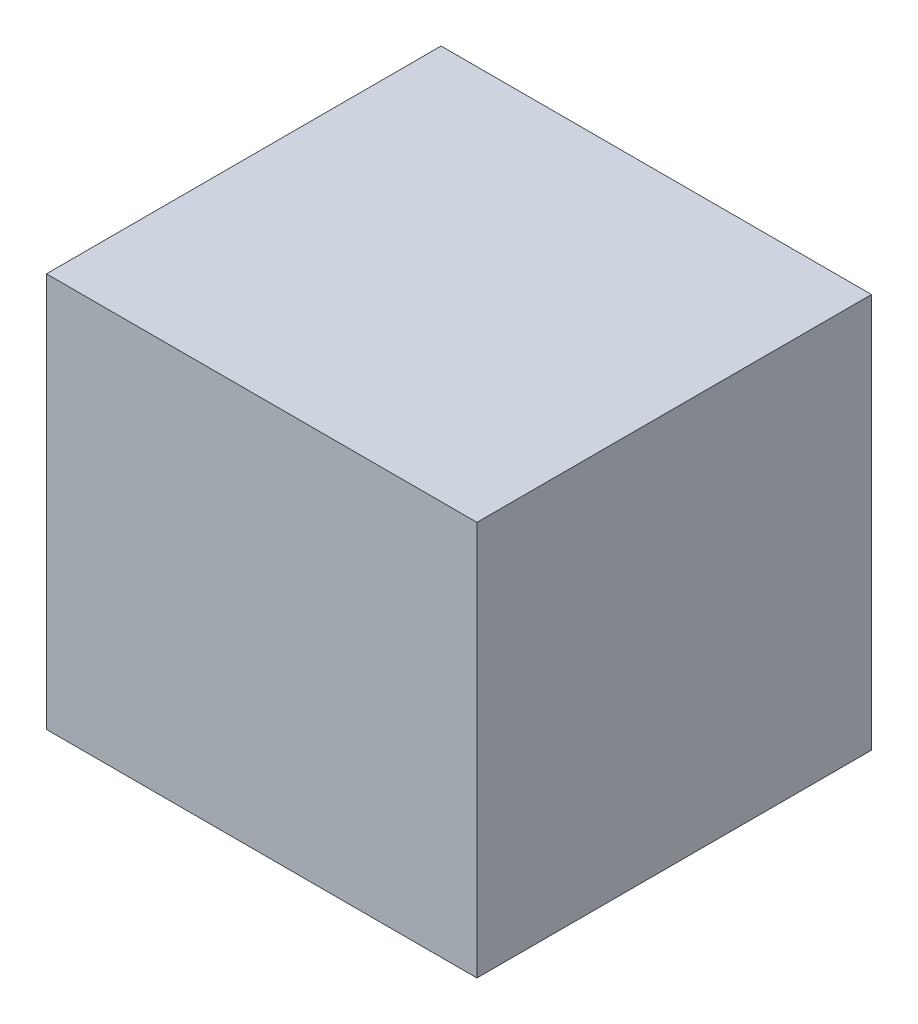
ISO-10303-21;
HEADER;
FILE_DESCRIPTION(('STEP AP214'),'2;1');
FILE_NAME('part.step','',(''),(''),'','','');
FILE_SCHEMA(('AUTOMOTIVE_DESIGN { 1 0 10303 214 1 1 1 1 }'));
ENDSEC;
DATA;
#1=APPLICATION_CONTEXT('core data for automotive mechanical design processes');
#2=APPLICATION_PROTOCOL_DEFINITION('international standard','automotive_design',2000,#1);
#3=PRODUCT_CONTEXT('',#1,'mechanical');
#4=PRODUCT('Part','Part','',(#3));
#5=PRODUCT_RELATED_PRODUCT_CATEGORY('part','',(#4));
#6=PRODUCT_DEFINITION_FORMATION('','',#4);
#7=PRODUCT_DEFINITION_CONTEXT('part definition',#1,'design');
#8=PRODUCT_DEFINITION('design','',#6,#7);
#9=PRODUCT_DEFINITION_SHAPE('','',#8);
#10=(LENGTH_UNIT() NAMED_UNIT(*) SI_UNIT(.MILLI.,.METRE.));
#11=(NAMED_UNIT(*) PLANE_ANGLE_UNIT() SI_UNIT($,.RADIAN.));
#12=(NAMED_UNIT(*) SI_UNIT($,.STERADIAN.) SOLID_ANGLE_UNIT());
#13=UNCERTAINTY_MEASURE_WITH_UNIT(LENGTH_MEASURE(1.E-05),#10,'distance_accuracy_value','');
#14=(GEOMETRIC_REPRESENTATION_CONTEXT(3) GLOBAL_UNCERTAINTY_ASSIGNED_CONTEXT((#13)) GLOBAL_UNIT_ASSIGNED_CONTEXT((#10,
#11,#12)) REPRESENTATION_CONTEXT('',''));
#15=CARTESIAN_POINT('',(0.,0.,0.));
#16=DIRECTION('',(0.,0.,1.));
#17=DIRECTION('',(1.,0.,0.));
#18=AXIS2_PLACEMENT_3D('',#15,#16,#17);
#19=CARTESIAN_POINT('',(-1200.,2200.,1100.));
#20=DIRECTION('',(1.,0.,0.));
#21=DIRECTION('',(0.,0.,-1.));
#22=AXIS2_PLACEMENT_3D('',#19,#20,#21);
#23=PLANE('',#22);
#24=DIRECTION('',(0.,0.,1.));
#25=VECTOR('',#24,1.);
#26=CARTESIAN_POINT('',(-1200.,0.,1100.));
#27=LINE('',#26,#25);
#28=CARTESIAN_POINT('',(-1200.,0.,-1100.));
#29=VERTEX_POINT('',#28);
#30=CARTESIAN_POINT('',(-1200.,0.,1100.));
#31=VERTEX_POINT('',#30);
#32=EDGE_CURVE('E116',#29,#31,#27,.T.);
#33=ORIENTED_EDGE('',*,*,#32,.T.);
#34=DIRECTION('',(0.,-1.,0.));
#35=VECTOR('',#34,1.);
#36=CARTESIAN_POINT('',(-1200.,2200.,1100.));
#37=LINE('',#36,#35);
#38=CARTESIAN_POINT('',(-1200.,2200.,1100.));
#39=VERTEX_POINT('',#38);
#40=EDGE_CURVE('E48',#39,#31,#37,.T.);
#41=ORIENTED_EDGE('',*,*,#40,.F.);
#42=DIRECTION('',(0.,0.,1.));
#43=VECTOR('',#42,1.);
#44=CARTESIAN_POINT('',(-1200.,2200.,1100.));
#45=LINE('',#44,#43);
#46=CARTESIAN_POINT('',(-1200.,2200.,-1100.));
#47=VERTEX_POINT('',#46);
#48=EDGE_CURVE('E99',#47,#39,#45,.T.);
#49=ORIENTED_EDGE('',*,*,#48,.F.);
#50=DIRECTION('',(0.,-1.,0.));
#51=VECTOR('',#50,1.);
#52=CARTESIAN_POINT('',(-1200.,2200.,-1100.));
#53=LINE('',#52,#51);
#54=EDGE_CURVE('E112',#47,#29,#53,.T.);
#55=ORIENTED_EDGE('',*,*,#54,.T.);
#56=EDGE_LOOP('',(#33,#41,#49,#55));
#57=FACE_BOUND('',#56,.T.);
#58=ADVANCED_FACE('F45',(#57),#23,.F.);
#59=CARTESIAN_POINT('',(1200.,2200.,1100.));
#60=DIRECTION('',(0.,0.,-1.));
#61=DIRECTION('',(-1.,0.,0.));
#62=AXIS2_PLACEMENT_3D('',#59,#60,#61);
#63=PLANE('',#62);
#64=DIRECTION('',(1.,0.,0.));
#65=VECTOR('',#64,1.);
#66=CARTESIAN_POINT('',(1200.,0.,1100.));
#67=LINE('',#66,#65);
#68=CARTESIAN_POINT('',(1200.,0.,1100.));
#69=VERTEX_POINT('',#68);
#70=EDGE_CURVE('E105',#31,#69,#67,.T.);
#71=ORIENTED_EDGE('',*,*,#70,.T.);
#72=DIRECTION('',(0.,-1.,0.));
#73=VECTOR('',#72,1.);
#74=CARTESIAN_POINT('',(1200.,2200.,1100.));
#75=LINE('',#74,#73);
#76=CARTESIAN_POINT('',(1200.,2200.,1100.));
#77=VERTEX_POINT('',#76);
#78=EDGE_CURVE('E103',#77,#69,#75,.T.);
#79=ORIENTED_EDGE('',*,*,#78,.F.);
#80=DIRECTION('',(1.,0.,0.));
#81=VECTOR('',#80,1.);
#82=CARTESIAN_POINT('',(1200.,2200.,1100.));
#83=LINE('',#82,#81);
#84=EDGE_CURVE('E94',#39,#77,#83,.T.);
#85=ORIENTED_EDGE('',*,*,#84,.F.);
#86=ORIENTED_EDGE('',*,*,#40,.T.);
#87=EDGE_LOOP('',(#71,#79,#85,#86));
#88=FACE_BOUND('',#87,.T.);
#89=ADVANCED_FACE('F104',(#88),#63,.F.);
#90=CARTESIAN_POINT('',(1200.,2200.,1100.));
#91=DIRECTION('',(-1.,0.,0.));
#92=DIRECTION('',(0.,0.,1.));
#93=AXIS2_PLACEMENT_3D('',#90,#91,#92);
#94=PLANE('',#93);
#95=DIRECTION('',(0.,0.,-1.));
#96=VECTOR('',#95,1.);
#97=CARTESIAN_POINT('',(1200.,0.,1100.));
#98=LINE('',#97,#96);
#99=CARTESIAN_POINT('',(1200.,0.,-1100.));
#100=VERTEX_POINT('',#99);
#101=EDGE_CURVE('E80',#69,#100,#98,.T.);
#102=ORIENTED_EDGE('',*,*,#101,.T.);
#103=DIRECTION('',(0.,-1.,0.));
#104=VECTOR('',#103,1.);
#105=CARTESIAN_POINT('',(1200.,2200.,-1100.));
#106=LINE('',#105,#104);
#107=CARTESIAN_POINT('',(1200.,2200.,-1100.));
#108=VERTEX_POINT('',#107);
#109=EDGE_CURVE('E107',#108,#100,#106,.T.);
#110=ORIENTED_EDGE('',*,*,#109,.F.);
#111=DIRECTION('',(0.,0.,-1.));
#112=VECTOR('',#111,1.);
#113=CARTESIAN_POINT('',(1200.,2200.,1100.));
#114=LINE('',#113,#112);
#115=EDGE_CURVE('E97',#77,#108,#114,.T.);
#116=ORIENTED_EDGE('',*,*,#115,.F.);
#117=ORIENTED_EDGE('',*,*,#78,.T.);
#118=EDGE_LOOP('',(#102,#110,#116,#117));
#119=FACE_BOUND('',#118,.T.);
#120=ADVANCED_FACE('F108',(#119),#94,.F.);
#121=CARTESIAN_POINT('',(1200.,2200.,-1100.));
#122=DIRECTION('',(0.,0.,1.));
#123=DIRECTION('',(1.,0.,0.));
#124=AXIS2_PLACEMENT_3D('',#121,#122,#123);
#125=PLANE('',#124);
#126=DIRECTION('',(-1.,0.,0.));
#127=VECTOR('',#126,1.);
#128=CARTESIAN_POINT('',(1200.,0.,-1100.));
#129=LINE('',#128,#127);
#130=EDGE_CURVE('E86',#100,#29,#129,.T.);
#131=ORIENTED_EDGE('',*,*,#130,.T.);
#132=ORIENTED_EDGE('',*,*,#54,.F.);
#133=DIRECTION('',(-1.,0.,0.));
#134=VECTOR('',#133,1.);
#135=CARTESIAN_POINT('',(1200.,2200.,-1100.));
#136=LINE('',#135,#134);
#137=EDGE_CURVE('E63',#108,#47,#136,.T.);
#138=ORIENTED_EDGE('',*,*,#137,.F.);
#139=ORIENTED_EDGE('',*,*,#109,.T.);
#140=EDGE_LOOP('',(#131,#132,#138,#139));
#141=FACE_BOUND('',#140,.T.);
#142=ADVANCED_FACE('F130',(#141),#125,.F.);
#143=CARTESIAN_POINT('',(0.,2200.,0.));
#144=DIRECTION('',(0.,1.,0.));
#145=DIRECTION('',(0.,0.,1.));
#146=AXIS2_PLACEMENT_3D('',#143,#144,#145);
#147=PLANE('',#146);
#148=ORIENTED_EDGE('',*,*,#48,.T.);
#149=ORIENTED_EDGE('',*,*,#84,.T.);
#150=ORIENTED_EDGE('',*,*,#115,.T.);
#151=ORIENTED_EDGE('',*,*,#137,.T.);
#152=EDGE_LOOP('',(#148,#149,#150,#151));
#153=FACE_BOUND('',#152,.T.);
#154=ADVANCED_FACE('F95',(#153),#147,.T.);
#155=CARTESIAN_POINT('',(0.,0.,0.));
#156=DIRECTION('',(0.,1.,0.));
#157=DIRECTION('',(0.,0.,1.));
#158=AXIS2_PLACEMENT_3D('',#155,#156,#157);
#159=PLANE('',#158);
#160=CARTESIAN_POINT('',(-2.22044604925031E-13,0.,2.22044604925031E-13));
#161=DIRECTION('',(0.,-1.,0.));
#162=DIRECTION('',(0.,0.,-1.));
#163=AXIS2_PLACEMENT_3D('',#160,#161,#162);
#164=CIRCLE('',#163,320.);
#165=CARTESIAN_POINT('',(-2.22044604925031E-13,0.,-320.));
#166=VERTEX_POINT('',#165);
#167=EDGE_CURVE('E11',#166,#166,#164,.T.);
#168=ORIENTED_EDGE('',*,*,#167,.F.);
#169=EDGE_LOOP('',(#168));
#170=FACE_BOUND('',#169,.T.);
#171=ORIENTED_EDGE('',*,*,#32,.F.);
#172=ORIENTED_EDGE('',*,*,#130,.F.);
#173=ORIENTED_EDGE('',*,*,#101,.F.);
#174=ORIENTED_EDGE('',*,*,#70,.F.);
#175=EDGE_LOOP('',(#171,#172,#173,#174));
#176=FACE_BOUND('',#175,.T.);
#177=ADVANCED_FACE('F133',(#170,#176),#159,.F.);
#178=CARTESIAN_POINT('',(-2.22044604925031E-13,-430.,2.22044604925031E-13));
#179=DIRECTION('',(0.,1.,0.));
#180=DIRECTION('',(0.,0.,1.));
#181=AXIS2_PLACEMENT_3D('',#178,#179,#180);
#182=CYLINDRICAL_SURFACE('',#181,320.);
#183=CARTESIAN_POINT('',(-2.22044604925031E-13,-430.,2.22044604925031E-13));
#184=DIRECTION('',(0.,-1.,0.));
#185=DIRECTION('',(0.,0.,-1.));
#186=AXIS2_PLACEMENT_3D('',#183,#184,#185);
#187=CIRCLE('',#186,320.);
#188=CARTESIAN_POINT('',(-2.22044604925031E-13,-430.,-320.));
#189=VERTEX_POINT('',#188);
#190=EDGE_CURVE('E120',#189,#189,#187,.T.);
#191=ORIENTED_EDGE('',*,*,#190,.F.);
#192=EDGE_LOOP('',(#191));
#193=FACE_BOUND('',#192,.T.);
#194=ORIENTED_EDGE('',*,*,#167,.T.);
#195=EDGE_LOOP('',(#194));
#196=FACE_BOUND('',#195,.T.);
#197=ADVANCED_FACE('F143',(#193,#196),#182,.T.);
#198=CARTESIAN_POINT('',(-2.22044604925031E-13,-430.,2.22044604925031E-13));
#199=DIRECTION('',(0.,-1.,0.));
#200=DIRECTION('',(0.,0.,-1.));
#201=AXIS2_PLACEMENT_3D('',#198,#199,#200);
#202=PLANE('',#201);
#203=ORIENTED_EDGE('',*,*,#190,.T.);
#204=EDGE_LOOP('',(#203));
#205=FACE_BOUND('',#204,.T.);
#206=ADVANCED_FACE('F141',(#205),#202,.T.);
#207=CLOSED_SHELL('',(#58,#89,#120,#142,#154,#177,#197,#206));
#208=MANIFOLD_SOLID_BREP('B2',#207);
#209=ADVANCED_BREP_SHAPE_REPRESENTATION('',(#18,#208),#14);
#210=SHAPE_DEFINITION_REPRESENTATION(#9,#209);
ENDSEC;
END-ISO-10303-21;
